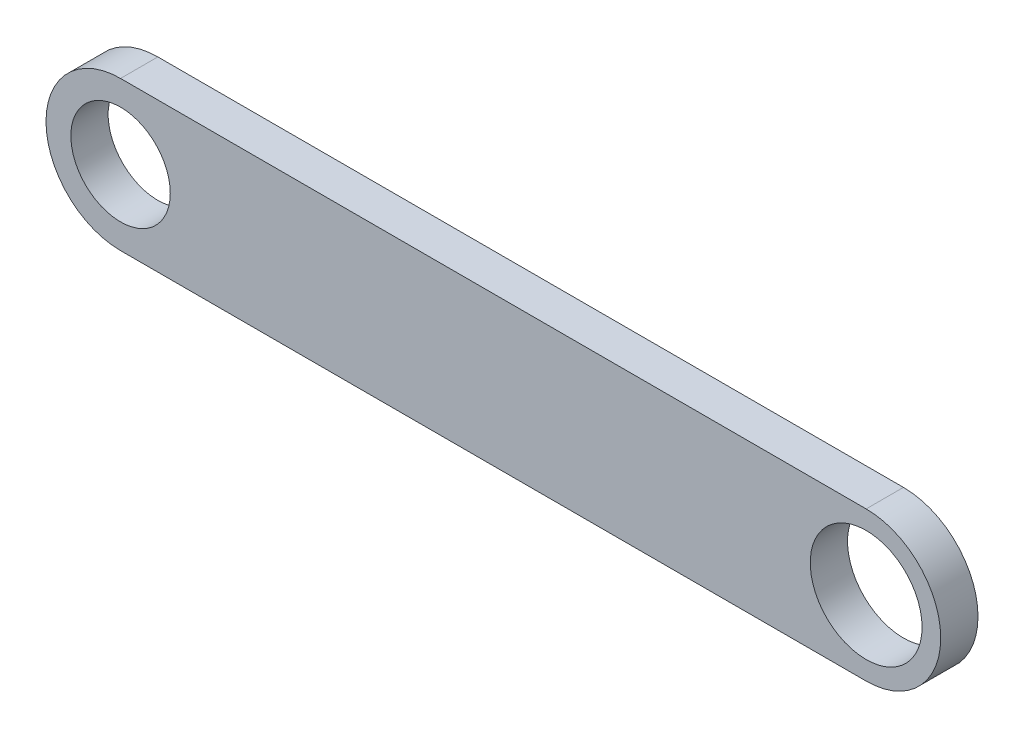
ISO-10303-21;
HEADER;
FILE_DESCRIPTION(('STEP AP214'),'2;1');
FILE_NAME('part.step','',(''),(''),'','','');
FILE_SCHEMA(('AUTOMOTIVE_DESIGN { 1 0 10303 214 1 1 1 1 }'));
ENDSEC;
DATA;
#1=APPLICATION_CONTEXT('core data for automotive mechanical design processes');
#2=APPLICATION_PROTOCOL_DEFINITION('international standard','automotive_design',2000,#1);
#3=PRODUCT_CONTEXT('',#1,'mechanical');
#4=PRODUCT('Part','Part','',(#3));
#5=PRODUCT_RELATED_PRODUCT_CATEGORY('part','',(#4));
#6=PRODUCT_DEFINITION_FORMATION('','',#4);
#7=PRODUCT_DEFINITION_CONTEXT('part definition',#1,'design');
#8=PRODUCT_DEFINITION('design','',#6,#7);
#9=PRODUCT_DEFINITION_SHAPE('','',#8);
#10=(LENGTH_UNIT() NAMED_UNIT(*) SI_UNIT(.MILLI.,.METRE.));
#11=(NAMED_UNIT(*) PLANE_ANGLE_UNIT() SI_UNIT($,.RADIAN.));
#12=(NAMED_UNIT(*) SI_UNIT($,.STERADIAN.) SOLID_ANGLE_UNIT());
#13=UNCERTAINTY_MEASURE_WITH_UNIT(LENGTH_MEASURE(1.E-05),#10,'distance_accuracy_value','');
#14=(GEOMETRIC_REPRESENTATION_CONTEXT(3) GLOBAL_UNCERTAINTY_ASSIGNED_CONTEXT((#13)) GLOBAL_UNIT_ASSIGNED_CONTEXT((#10,
#11,#12)) REPRESENTATION_CONTEXT('',''));
#15=CARTESIAN_POINT('',(0.,0.,0.));
#16=DIRECTION('',(0.,0.,1.));
#17=DIRECTION('',(1.,0.,0.));
#18=AXIS2_PLACEMENT_3D('',#15,#16,#17);
#19=CARTESIAN_POINT('',(-83.3972809556366,51.3376016661324,0.5));
#20=DIRECTION('',(0.,0.,1.));
#21=DIRECTION('',(1.,0.,0.));
#22=AXIS2_PLACEMENT_3D('',#19,#20,#21);
#23=PLANE('',#22);
#24=CARTESIAN_POINT('',(-83.3972809556366,51.3376016661324,0.5));
#25=DIRECTION('',(0.,0.,1.));
#26=DIRECTION('',(1.,0.,0.));
#27=AXIS2_PLACEMENT_3D('',#24,#25,#26);
#28=CIRCLE('',#27,1.33333333333333);
#29=CARTESIAN_POINT('',(-82.0639476223033,51.3376016661324,0.5));
#30=VERTEX_POINT('',#29);
#31=EDGE_CURVE('E100',#30,#30,#28,.T.);
#32=ORIENTED_EDGE('',*,*,#31,.F.);
#33=EDGE_LOOP('',(#32));
#34=FACE_BOUND('',#33,.T.);
#35=CARTESIAN_POINT('',(-83.3972809556366,51.3376016661324,0.5));
#36=DIRECTION('',(0.,0.,1.));
#37=DIRECTION('',(1.,0.,0.));
#38=AXIS2_PLACEMENT_3D('',#35,#36,#37);
#39=CIRCLE('',#38,2.);
#40=CARTESIAN_POINT('',(-83.3972809556366,53.3376016661324,0.5));
#41=VERTEX_POINT('',#40);
#42=CARTESIAN_POINT('',(-83.3972809556366,49.3376016661324,0.5));
#43=VERTEX_POINT('',#42);
#44=EDGE_CURVE('E85',#41,#43,#39,.T.);
#45=ORIENTED_EDGE('',*,*,#44,.T.);
#46=DIRECTION('',(1.,0.,0.));
#47=VECTOR('',#46,1.);
#48=CARTESIAN_POINT('',(-83.3972809556366,49.3376016661324,0.5));
#49=LINE('',#48,#47);
#50=CARTESIAN_POINT('',(-63.3972809556366,49.3376016661324,0.5));
#51=VERTEX_POINT('',#50);
#52=EDGE_CURVE('E80',#43,#51,#49,.T.);
#53=ORIENTED_EDGE('',*,*,#52,.T.);
#54=CARTESIAN_POINT('',(-63.3972809556366,51.3376016661324,0.5));
#55=DIRECTION('',(0.,0.,1.));
#56=DIRECTION('',(1.,0.,0.));
#57=AXIS2_PLACEMENT_3D('',#54,#55,#56);
#58=CIRCLE('',#57,2.00000000000001);
#59=CARTESIAN_POINT('',(-63.3972809556366,53.3376016661324,0.5));
#60=VERTEX_POINT('',#59);
#61=EDGE_CURVE('E83',#51,#60,#58,.T.);
#62=ORIENTED_EDGE('',*,*,#61,.T.);
#63=DIRECTION('',(-1.,0.,0.));
#64=VECTOR('',#63,1.);
#65=CARTESIAN_POINT('',(-83.3972809556366,53.3376016661324,0.5));
#66=LINE('',#65,#64);
#67=EDGE_CURVE('E50',#60,#41,#66,.T.);
#68=ORIENTED_EDGE('',*,*,#67,.T.);
#69=EDGE_LOOP('',(#45,#53,#62,#68));
#70=FACE_BOUND('',#69,.T.);
#71=CARTESIAN_POINT('',(-63.3972809556366,51.3376016661324,0.5));
#72=DIRECTION('',(0.,0.,1.));
#73=DIRECTION('',(1.,0.,0.));
#74=AXIS2_PLACEMENT_3D('',#71,#72,#73);
#75=CIRCLE('',#74,1.5);
#76=CARTESIAN_POINT('',(-61.8972809556366,51.3376016661324,0.5));
#77=VERTEX_POINT('',#76);
#78=EDGE_CURVE('E115',#77,#77,#75,.T.);
#79=ORIENTED_EDGE('',*,*,#78,.F.);
#80=EDGE_LOOP('',(#79));
#81=FACE_BOUND('',#80,.T.);
#82=ADVANCED_FACE('F33',(#34,#70,#81),#23,.T.);
#83=CARTESIAN_POINT('',(-83.3972809556366,51.3376016661324,-0.5));
#84=DIRECTION('',(0.,0.,1.));
#85=DIRECTION('',(1.,0.,0.));
#86=AXIS2_PLACEMENT_3D('',#83,#84,#85);
#87=PLANE('',#86);
#88=CARTESIAN_POINT('',(-83.3972809556366,51.3376016661324,-0.5));
#89=DIRECTION('',(0.,0.,1.));
#90=DIRECTION('',(1.,0.,0.));
#91=AXIS2_PLACEMENT_3D('',#88,#89,#90);
#92=CIRCLE('',#91,2.);
#93=CARTESIAN_POINT('',(-83.3972809556366,53.3376016661324,-0.5));
#94=VERTEX_POINT('',#93);
#95=CARTESIAN_POINT('',(-83.3972809556366,49.3376016661324,-0.5));
#96=VERTEX_POINT('',#95);
#97=EDGE_CURVE('E97',#94,#96,#92,.T.);
#98=ORIENTED_EDGE('',*,*,#97,.F.);
#99=DIRECTION('',(-1.,0.,0.));
#100=VECTOR('',#99,1.);
#101=CARTESIAN_POINT('',(-83.3972809556366,53.3376016661324,-0.5));
#102=LINE('',#101,#100);
#103=CARTESIAN_POINT('',(-63.3972809556366,53.3376016661324,-0.5));
#104=VERTEX_POINT('',#103);
#105=EDGE_CURVE('E73',#104,#94,#102,.T.);
#106=ORIENTED_EDGE('',*,*,#105,.F.);
#107=CARTESIAN_POINT('',(-63.3972809556366,51.3376016661324,-0.5));
#108=DIRECTION('',(0.,0.,1.));
#109=DIRECTION('',(1.,0.,0.));
#110=AXIS2_PLACEMENT_3D('',#107,#108,#109);
#111=CIRCLE('',#110,2.00000000000001);
#112=CARTESIAN_POINT('',(-63.3972809556366,49.3376016661324,-0.5));
#113=VERTEX_POINT('',#112);
#114=EDGE_CURVE('E67',#113,#104,#111,.T.);
#115=ORIENTED_EDGE('',*,*,#114,.F.);
#116=DIRECTION('',(1.,0.,0.));
#117=VECTOR('',#116,1.);
#118=CARTESIAN_POINT('',(-83.3972809556366,49.3376016661324,-0.5));
#119=LINE('',#118,#117);
#120=EDGE_CURVE('E89',#96,#113,#119,.T.);
#121=ORIENTED_EDGE('',*,*,#120,.F.);
#122=EDGE_LOOP('',(#98,#106,#115,#121));
#123=FACE_BOUND('',#122,.T.);
#124=CARTESIAN_POINT('',(-83.3972809556366,51.3376016661324,-0.5));
#125=DIRECTION('',(0.,0.,1.));
#126=DIRECTION('',(1.,0.,0.));
#127=AXIS2_PLACEMENT_3D('',#124,#125,#126);
#128=CIRCLE('',#127,1.33333333333333);
#129=CARTESIAN_POINT('',(-82.0639476223033,51.3376016661324,-0.5));
#130=VERTEX_POINT('',#129);
#131=EDGE_CURVE('E112',#130,#130,#128,.T.);
#132=ORIENTED_EDGE('',*,*,#131,.T.);
#133=EDGE_LOOP('',(#132));
#134=FACE_BOUND('',#133,.T.);
#135=CARTESIAN_POINT('',(-63.3972809556366,51.3376016661324,-0.5));
#136=DIRECTION('',(0.,0.,1.));
#137=DIRECTION('',(1.,0.,0.));
#138=AXIS2_PLACEMENT_3D('',#135,#136,#137);
#139=CIRCLE('',#138,1.5);
#140=CARTESIAN_POINT('',(-61.8972809556366,51.3376016661324,-0.5));
#141=VERTEX_POINT('',#140);
#142=EDGE_CURVE('E118',#141,#141,#139,.T.);
#143=ORIENTED_EDGE('',*,*,#142,.T.);
#144=EDGE_LOOP('',(#143));
#145=FACE_BOUND('',#144,.T.);
#146=ADVANCED_FACE('F108',(#123,#134,#145),#87,.F.);
#147=CARTESIAN_POINT('',(-83.3972809556366,51.3376016661324,0.5));
#148=DIRECTION('',(0.,0.,-1.));
#149=DIRECTION('',(-1.,0.,0.));
#150=AXIS2_PLACEMENT_3D('',#147,#148,#149);
#151=CYLINDRICAL_SURFACE('',#150,2.);
#152=ORIENTED_EDGE('',*,*,#97,.T.);
#153=DIRECTION('',(0.,0.,-1.));
#154=VECTOR('',#153,1.);
#155=CARTESIAN_POINT('',(-83.3972809556366,49.3376016661324,0.5));
#156=LINE('',#155,#154);
#157=EDGE_CURVE('E11',#43,#96,#156,.T.);
#158=ORIENTED_EDGE('',*,*,#157,.F.);
#159=ORIENTED_EDGE('',*,*,#44,.F.);
#160=DIRECTION('',(0.,0.,-1.));
#161=VECTOR('',#160,1.);
#162=CARTESIAN_POINT('',(-83.3972809556366,53.3376016661324,0.5));
#163=LINE('',#162,#161);
#164=EDGE_CURVE('E93',#41,#94,#163,.T.);
#165=ORIENTED_EDGE('',*,*,#164,.T.);
#166=EDGE_LOOP('',(#152,#158,#159,#165));
#167=FACE_BOUND('',#166,.T.);
#168=ADVANCED_FACE('F35',(#167),#151,.T.);
#169=CARTESIAN_POINT('',(-83.3972809556366,49.3376016661324,0.5));
#170=DIRECTION('',(0.,1.,0.));
#171=DIRECTION('',(-1.,0.,0.));
#172=AXIS2_PLACEMENT_3D('',#169,#170,#171);
#173=PLANE('',#172);
#174=ORIENTED_EDGE('',*,*,#120,.T.);
#175=DIRECTION('',(0.,0.,-1.));
#176=VECTOR('',#175,1.);
#177=CARTESIAN_POINT('',(-63.3972809556366,49.3376016661324,0.5));
#178=LINE('',#177,#176);
#179=EDGE_CURVE('E42',#51,#113,#178,.T.);
#180=ORIENTED_EDGE('',*,*,#179,.F.);
#181=ORIENTED_EDGE('',*,*,#52,.F.);
#182=ORIENTED_EDGE('',*,*,#157,.T.);
#183=EDGE_LOOP('',(#174,#180,#181,#182));
#184=FACE_BOUND('',#183,.T.);
#185=ADVANCED_FACE('F88',(#184),#173,.F.);
#186=CARTESIAN_POINT('',(-63.3972809556366,51.3376016661324,0.5));
#187=DIRECTION('',(0.,0.,-1.));
#188=DIRECTION('',(-1.,0.,0.));
#189=AXIS2_PLACEMENT_3D('',#186,#187,#188);
#190=CYLINDRICAL_SURFACE('',#189,2.00000000000001);
#191=ORIENTED_EDGE('',*,*,#114,.T.);
#192=DIRECTION('',(0.,0.,-1.));
#193=VECTOR('',#192,1.);
#194=CARTESIAN_POINT('',(-63.3972809556366,53.3376016661324,0.5));
#195=LINE('',#194,#193);
#196=EDGE_CURVE('E90',#60,#104,#195,.T.);
#197=ORIENTED_EDGE('',*,*,#196,.F.);
#198=ORIENTED_EDGE('',*,*,#61,.F.);
#199=ORIENTED_EDGE('',*,*,#179,.T.);
#200=EDGE_LOOP('',(#191,#197,#198,#199));
#201=FACE_BOUND('',#200,.T.);
#202=ADVANCED_FACE('F91',(#201),#190,.T.);
#203=CARTESIAN_POINT('',(-83.3972809556366,53.3376016661324,0.5));
#204=DIRECTION('',(0.,-1.,0.));
#205=DIRECTION('',(1.,0.,0.));
#206=AXIS2_PLACEMENT_3D('',#203,#204,#205);
#207=PLANE('',#206);
#208=ORIENTED_EDGE('',*,*,#105,.T.);
#209=ORIENTED_EDGE('',*,*,#164,.F.);
#210=ORIENTED_EDGE('',*,*,#67,.F.);
#211=ORIENTED_EDGE('',*,*,#196,.T.);
#212=EDGE_LOOP('',(#208,#209,#210,#211));
#213=FACE_BOUND('',#212,.T.);
#214=ADVANCED_FACE('F105',(#213),#207,.F.);
#215=CARTESIAN_POINT('',(-83.3972809556366,51.3376016661324,0.5));
#216=DIRECTION('',(0.,0.,-1.));
#217=DIRECTION('',(-1.,0.,0.));
#218=AXIS2_PLACEMENT_3D('',#215,#216,#217);
#219=CYLINDRICAL_SURFACE('',#218,1.33333333333333);
#220=ORIENTED_EDGE('',*,*,#31,.T.);
#221=EDGE_LOOP('',(#220));
#222=FACE_BOUND('',#221,.T.);
#223=ORIENTED_EDGE('',*,*,#131,.F.);
#224=EDGE_LOOP('',(#223));
#225=FACE_BOUND('',#224,.T.);
#226=ADVANCED_FACE('F135',(#222,#225),#219,.F.);
#227=CARTESIAN_POINT('',(-63.3972809556366,51.3376016661324,0.5));
#228=DIRECTION('',(0.,0.,-1.));
#229=DIRECTION('',(-1.,0.,0.));
#230=AXIS2_PLACEMENT_3D('',#227,#228,#229);
#231=CYLINDRICAL_SURFACE('',#230,1.5);
#232=ORIENTED_EDGE('',*,*,#78,.T.);
#233=EDGE_LOOP('',(#232));
#234=FACE_BOUND('',#233,.T.);
#235=ORIENTED_EDGE('',*,*,#142,.F.);
#236=EDGE_LOOP('',(#235));
#237=FACE_BOUND('',#236,.T.);
#238=ADVANCED_FACE('F124',(#234,#237),#231,.F.);
#239=CLOSED_SHELL('',(#82,#146,#168,#185,#202,#214,#226,#238));
#240=MANIFOLD_SOLID_BREP('B2',#239);
#241=ADVANCED_BREP_SHAPE_REPRESENTATION('',(#18,#240),#14);
#242=SHAPE_DEFINITION_REPRESENTATION(#9,#241);
ENDSEC;
END-ISO-10303-21;
